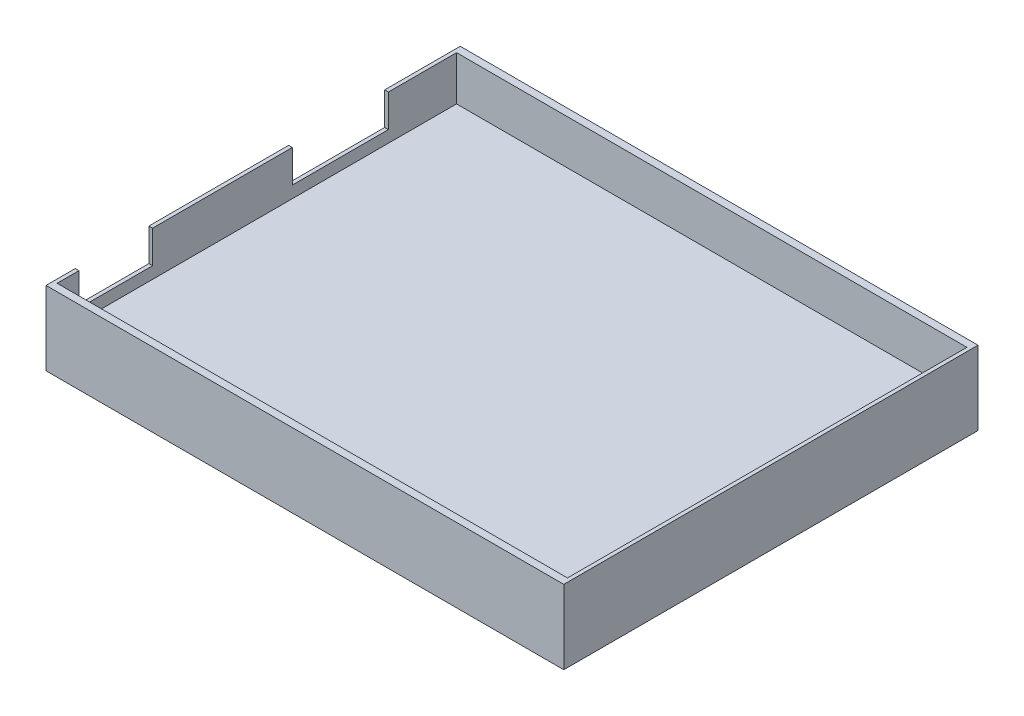
ISO-10303-21;
HEADER;
FILE_DESCRIPTION(('STEP AP214'),'2;1');
FILE_NAME('part.step','',(''),(''),'','','');
FILE_SCHEMA(('AUTOMOTIVE_DESIGN { 1 0 10303 214 1 1 1 1 }'));
ENDSEC;
DATA;
#1=APPLICATION_CONTEXT('core data for automotive mechanical design processes');
#2=APPLICATION_PROTOCOL_DEFINITION('international standard','automotive_design',2000,#1);
#3=PRODUCT_CONTEXT('',#1,'mechanical');
#4=PRODUCT('Part','Part','',(#3));
#5=PRODUCT_RELATED_PRODUCT_CATEGORY('part','',(#4));
#6=PRODUCT_DEFINITION_FORMATION('','',#4);
#7=PRODUCT_DEFINITION_CONTEXT('part definition',#1,'design');
#8=PRODUCT_DEFINITION('design','',#6,#7);
#9=PRODUCT_DEFINITION_SHAPE('','',#8);
#10=(LENGTH_UNIT() NAMED_UNIT(*) SI_UNIT(.MILLI.,.METRE.));
#11=(NAMED_UNIT(*) PLANE_ANGLE_UNIT() SI_UNIT($,.RADIAN.));
#12=(NAMED_UNIT(*) SI_UNIT($,.STERADIAN.) SOLID_ANGLE_UNIT());
#13=UNCERTAINTY_MEASURE_WITH_UNIT(LENGTH_MEASURE(1.E-05),#10,'distance_accuracy_value','');
#14=(GEOMETRIC_REPRESENTATION_CONTEXT(3) GLOBAL_UNCERTAINTY_ASSIGNED_CONTEXT((#13)) GLOBAL_UNIT_ASSIGNED_CONTEXT((#10,
#11,#12)) REPRESENTATION_CONTEXT('',''));
#15=CARTESIAN_POINT('',(0.,0.,0.));
#16=DIRECTION('',(0.,0.,1.));
#17=DIRECTION('',(1.,0.,0.));
#18=AXIS2_PLACEMENT_3D('',#15,#16,#17);
#19=CARTESIAN_POINT('',(0.,10.,0.));
#20=DIRECTION('',(0.,-1.,0.));
#21=DIRECTION('',(0.,0.,-1.));
#22=AXIS2_PLACEMENT_3D('',#19,#20,#21);
#23=PLANE('',#22);
#24=DIRECTION('',(0.,0.,1.));
#25=VECTOR('',#24,1.);
#26=CARTESIAN_POINT('',(-34.5,10.,27.));
#27=LINE('',#26,#25);
#28=CARTESIAN_POINT('',(-34.5,10.,-4.79624898113309));
#29=VERTEX_POINT('',#28);
#30=CARTESIAN_POINT('',(-34.5,10.,14.096419397395));
#31=VERTEX_POINT('',#30);
#32=EDGE_CURVE('E233',#29,#31,#27,.T.);
#33=ORIENTED_EDGE('',*,*,#32,.F.);
#34=DIRECTION('',(-1.,0.,0.));
#35=VECTOR('',#34,1.);
#36=CARTESIAN_POINT('',(0.,10.,-4.79624898113309));
#37=LINE('',#36,#35);
#38=CARTESIAN_POINT('',(-35.,10.,-4.79624898113309));
#39=VERTEX_POINT('',#38);
#40=EDGE_CURVE('E205',#29,#39,#37,.T.);
#41=ORIENTED_EDGE('',*,*,#40,.T.);
#42=DIRECTION('',(0.,0.,1.));
#43=VECTOR('',#42,1.);
#44=CARTESIAN_POINT('',(-35.,10.,28.));
#45=LINE('',#44,#43);
#46=CARTESIAN_POINT('',(-35.,10.,14.096419397395));
#47=VERTEX_POINT('',#46);
#48=EDGE_CURVE('E270',#39,#47,#45,.T.);
#49=ORIENTED_EDGE('',*,*,#48,.T.);
#50=DIRECTION('',(1.,0.,0.));
#51=VECTOR('',#50,1.);
#52=CARTESIAN_POINT('',(0.,10.,14.096419397395));
#53=LINE('',#52,#51);
#54=EDGE_CURVE('E179',#47,#31,#53,.T.);
#55=ORIENTED_EDGE('',*,*,#54,.T.);
#56=EDGE_LOOP('',(#33,#41,#49,#55));
#57=FACE_BOUND('',#56,.T.);
#58=ADVANCED_FACE('F38',(#57),#23,.F.);
#59=CARTESIAN_POINT('',(35.,10.,28.));
#60=DIRECTION('',(-1.,0.,0.));
#61=DIRECTION('',(0.,0.,1.));
#62=AXIS2_PLACEMENT_3D('',#59,#60,#61);
#63=PLANE('',#62);
#64=DIRECTION('',(0.,0.,-1.));
#65=VECTOR('',#64,1.);
#66=CARTESIAN_POINT('',(35.,0.,28.));
#67=LINE('',#66,#65);
#68=CARTESIAN_POINT('',(35.,0.,28.));
#69=VERTEX_POINT('',#68);
#70=CARTESIAN_POINT('',(35.,0.,-28.));
#71=VERTEX_POINT('',#70);
#72=EDGE_CURVE('E247',#69,#71,#67,.T.);
#73=ORIENTED_EDGE('',*,*,#72,.T.);
#74=DIRECTION('',(0.,-1.,0.));
#75=VECTOR('',#74,1.);
#76=CARTESIAN_POINT('',(35.,10.,-28.));
#77=LINE('',#76,#75);
#78=CARTESIAN_POINT('',(35.,10.,-28.));
#79=VERTEX_POINT('',#78);
#80=EDGE_CURVE('E296',#79,#71,#77,.T.);
#81=ORIENTED_EDGE('',*,*,#80,.F.);
#82=DIRECTION('',(0.,0.,-1.));
#83=VECTOR('',#82,1.);
#84=CARTESIAN_POINT('',(35.,10.,28.));
#85=LINE('',#84,#83);
#86=CARTESIAN_POINT('',(35.,10.,28.));
#87=VERTEX_POINT('',#86);
#88=EDGE_CURVE('E257',#87,#79,#85,.T.);
#89=ORIENTED_EDGE('',*,*,#88,.F.);
#90=DIRECTION('',(0.,-1.,0.));
#91=VECTOR('',#90,1.);
#92=CARTESIAN_POINT('',(35.,10.,28.));
#93=LINE('',#92,#91);
#94=EDGE_CURVE('E273',#87,#69,#93,.T.);
#95=ORIENTED_EDGE('',*,*,#94,.T.);
#96=EDGE_LOOP('',(#73,#81,#89,#95));
#97=FACE_BOUND('',#96,.T.);
#98=ADVANCED_FACE('F40',(#97),#63,.F.);
#99=CARTESIAN_POINT('',(-35.,10.,-28.));
#100=DIRECTION('',(0.,0.,1.));
#101=DIRECTION('',(1.,0.,0.));
#102=AXIS2_PLACEMENT_3D('',#99,#100,#101);
#103=PLANE('',#102);
#104=DIRECTION('',(-1.,0.,0.));
#105=VECTOR('',#104,1.);
#106=CARTESIAN_POINT('',(-35.,0.,-28.));
#107=LINE('',#106,#105);
#108=CARTESIAN_POINT('',(-35.,0.,-28.));
#109=VERTEX_POINT('',#108);
#110=EDGE_CURVE('E277',#71,#109,#107,.T.);
#111=ORIENTED_EDGE('',*,*,#110,.T.);
#112=DIRECTION('',(0.,-1.,0.));
#113=VECTOR('',#112,1.);
#114=CARTESIAN_POINT('',(-35.,10.,-28.));
#115=LINE('',#114,#113);
#116=CARTESIAN_POINT('',(-35.,10.,-28.));
#117=VERTEX_POINT('',#116);
#118=EDGE_CURVE('E292',#117,#109,#115,.T.);
#119=ORIENTED_EDGE('',*,*,#118,.F.);
#120=DIRECTION('',(-1.,0.,0.));
#121=VECTOR('',#120,1.);
#122=CARTESIAN_POINT('',(-35.,10.,-28.));
#123=LINE('',#122,#121);
#124=EDGE_CURVE('E261',#79,#117,#123,.T.);
#125=ORIENTED_EDGE('',*,*,#124,.F.);
#126=ORIENTED_EDGE('',*,*,#80,.T.);
#127=EDGE_LOOP('',(#111,#119,#125,#126));
#128=FACE_BOUND('',#127,.T.);
#129=ADVANCED_FACE('F381',(#128),#103,.F.);
#130=CARTESIAN_POINT('',(-35.,10.,28.));
#131=DIRECTION('',(1.,0.,0.));
#132=DIRECTION('',(0.,0.,-1.));
#133=AXIS2_PLACEMENT_3D('',#130,#131,#132);
#134=PLANE('',#133);
#135=ORIENTED_EDGE('',*,*,#48,.F.);
#136=DIRECTION('',(0.,1.,0.));
#137=VECTOR('',#136,1.);
#138=CARTESIAN_POINT('',(-35.,16.3548620356426,-4.79624898113309));
#139=LINE('',#138,#137);
#140=CARTESIAN_POINT('',(-35.,5.6,-4.79624898113309));
#141=VERTEX_POINT('',#140);
#142=EDGE_CURVE('E170',#141,#39,#139,.T.);
#143=ORIENTED_EDGE('',*,*,#142,.F.);
#144=DIRECTION('',(0.,0.,1.));
#145=VECTOR('',#144,1.);
#146=CARTESIAN_POINT('',(-35.,5.6,-4.79624898113309));
#147=LINE('',#146,#145);
#148=CARTESIAN_POINT('',(-35.,5.6,-17.7896473127418));
#149=VERTEX_POINT('',#148);
#150=EDGE_CURVE('E154',#149,#141,#147,.T.);
#151=ORIENTED_EDGE('',*,*,#150,.F.);
#152=DIRECTION('',(0.,-1.,0.));
#153=VECTOR('',#152,1.);
#154=CARTESIAN_POINT('',(-35.,16.3548620356426,-17.7896473127418));
#155=LINE('',#154,#153);
#156=CARTESIAN_POINT('',(-35.,10.,-17.7896473127418));
#157=VERTEX_POINT('',#156);
#158=EDGE_CURVE('E162',#157,#149,#155,.T.);
#159=ORIENTED_EDGE('',*,*,#158,.F.);
#160=EDGE_CURVE('E266',#117,#157,#45,.T.);
#161=ORIENTED_EDGE('',*,*,#160,.F.);
#162=ORIENTED_EDGE('',*,*,#118,.T.);
#163=DIRECTION('',(0.,0.,1.));
#164=VECTOR('',#163,1.);
#165=CARTESIAN_POINT('',(-35.,0.,28.));
#166=LINE('',#165,#164);
#167=CARTESIAN_POINT('',(-35.,0.,28.));
#168=VERTEX_POINT('',#167);
#169=EDGE_CURVE('E280',#109,#168,#166,.T.);
#170=ORIENTED_EDGE('',*,*,#169,.T.);
#171=DIRECTION('',(0.,-1.,0.));
#172=VECTOR('',#171,1.);
#173=CARTESIAN_POINT('',(-35.,10.,28.));
#174=LINE('',#173,#172);
#175=CARTESIAN_POINT('',(-35.,10.,28.));
#176=VERTEX_POINT('',#175);
#177=EDGE_CURVE('E288',#176,#168,#174,.T.);
#178=ORIENTED_EDGE('',*,*,#177,.F.);
#179=CARTESIAN_POINT('',(-35.,10.,24.0501544575814));
#180=VERTEX_POINT('',#179);
#181=EDGE_CURVE('E265',#180,#176,#45,.T.);
#182=ORIENTED_EDGE('',*,*,#181,.F.);
#183=DIRECTION('',(0.,1.,0.));
#184=VECTOR('',#183,1.);
#185=CARTESIAN_POINT('',(-35.,16.1,24.0501544575814));
#186=LINE('',#185,#184);
#187=CARTESIAN_POINT('',(-35.,5.6,24.0501544575814));
#188=VERTEX_POINT('',#187);
#189=EDGE_CURVE('E181',#188,#180,#186,.T.);
#190=ORIENTED_EDGE('',*,*,#189,.F.);
#191=DIRECTION('',(0.,0.,1.));
#192=VECTOR('',#191,1.);
#193=CARTESIAN_POINT('',(-35.,5.6,24.0501544575814));
#194=LINE('',#193,#192);
#195=CARTESIAN_POINT('',(-35.,5.6,14.096419397395));
#196=VERTEX_POINT('',#195);
#197=EDGE_CURVE('E187',#196,#188,#194,.T.);
#198=ORIENTED_EDGE('',*,*,#197,.F.);
#199=DIRECTION('',(0.,-1.,0.));
#200=VECTOR('',#199,1.);
#201=CARTESIAN_POINT('',(-35.,16.1,14.096419397395));
#202=LINE('',#201,#200);
#203=EDGE_CURVE('E184',#47,#196,#202,.T.);
#204=ORIENTED_EDGE('',*,*,#203,.F.);
#205=EDGE_LOOP('',(#135,#143,#151,#159,#161,#162,#170,#178,#182,#190,#198,#204));
#206=FACE_BOUND('',#205,.T.);
#207=ADVANCED_FACE('F173',(#206),#134,.F.);
#208=CARTESIAN_POINT('',(-35.,10.,28.));
#209=DIRECTION('',(0.,0.,-1.));
#210=DIRECTION('',(-1.,0.,0.));
#211=AXIS2_PLACEMENT_3D('',#208,#209,#210);
#212=PLANE('',#211);
#213=DIRECTION('',(1.,0.,0.));
#214=VECTOR('',#213,1.);
#215=CARTESIAN_POINT('',(-35.,0.,28.));
#216=LINE('',#215,#214);
#217=EDGE_CURVE('E262',#168,#69,#216,.T.);
#218=ORIENTED_EDGE('',*,*,#217,.T.);
#219=ORIENTED_EDGE('',*,*,#94,.F.);
#220=DIRECTION('',(1.,0.,0.));
#221=VECTOR('',#220,1.);
#222=CARTESIAN_POINT('',(-35.,10.,28.));
#223=LINE('',#222,#221);
#224=EDGE_CURVE('E269',#176,#87,#223,.T.);
#225=ORIENTED_EDGE('',*,*,#224,.F.);
#226=ORIENTED_EDGE('',*,*,#177,.T.);
#227=EDGE_LOOP('',(#218,#219,#225,#226));
#228=FACE_BOUND('',#227,.T.);
#229=ADVANCED_FACE('F333',(#228),#212,.F.);
#230=ORIENTED_EDGE('',*,*,#160,.T.);
#231=DIRECTION('',(1.,0.,0.));
#232=VECTOR('',#231,1.);
#233=CARTESIAN_POINT('',(0.,10.,-17.7896473127418));
#234=LINE('',#233,#232);
#235=CARTESIAN_POINT('',(-34.5,10.,-17.7896473127418));
#236=VERTEX_POINT('',#235);
#237=EDGE_CURVE('E165',#157,#236,#234,.T.);
#238=ORIENTED_EDGE('',*,*,#237,.T.);
#239=CARTESIAN_POINT('',(-34.5,10.,-27.));
#240=VERTEX_POINT('',#239);
#241=EDGE_CURVE('E228',#240,#236,#27,.T.);
#242=ORIENTED_EDGE('',*,*,#241,.F.);
#243=DIRECTION('',(-1.,0.,0.));
#244=VECTOR('',#243,1.);
#245=CARTESIAN_POINT('',(34.5,10.,-27.));
#246=LINE('',#245,#244);
#247=CARTESIAN_POINT('',(34.5,10.,-27.));
#248=VERTEX_POINT('',#247);
#249=EDGE_CURVE('E215',#248,#240,#246,.T.);
#250=ORIENTED_EDGE('',*,*,#249,.F.);
#251=DIRECTION('',(0.,0.,-1.));
#252=VECTOR('',#251,1.);
#253=CARTESIAN_POINT('',(34.5,10.,27.));
#254=LINE('',#253,#252);
#255=CARTESIAN_POINT('',(34.5,10.,27.));
#256=VERTEX_POINT('',#255);
#257=EDGE_CURVE('E237',#256,#248,#254,.T.);
#258=ORIENTED_EDGE('',*,*,#257,.F.);
#259=DIRECTION('',(1.,0.,0.));
#260=VECTOR('',#259,1.);
#261=CARTESIAN_POINT('',(34.5,10.,27.));
#262=LINE('',#261,#260);
#263=CARTESIAN_POINT('',(-34.5,10.,27.));
#264=VERTEX_POINT('',#263);
#265=EDGE_CURVE('E232',#264,#256,#262,.T.);
#266=ORIENTED_EDGE('',*,*,#265,.F.);
#267=CARTESIAN_POINT('',(-34.5,10.,24.0501544575814));
#268=VERTEX_POINT('',#267);
#269=EDGE_CURVE('E209',#268,#264,#27,.T.);
#270=ORIENTED_EDGE('',*,*,#269,.F.);
#271=DIRECTION('',(-1.,0.,0.));
#272=VECTOR('',#271,1.);
#273=CARTESIAN_POINT('',(0.,10.,24.0501544575814));
#274=LINE('',#273,#272);
#275=EDGE_CURVE('E199',#268,#180,#274,.T.);
#276=ORIENTED_EDGE('',*,*,#275,.T.);
#277=ORIENTED_EDGE('',*,*,#181,.T.);
#278=ORIENTED_EDGE('',*,*,#224,.T.);
#279=ORIENTED_EDGE('',*,*,#88,.T.);
#280=ORIENTED_EDGE('',*,*,#124,.T.);
#281=EDGE_LOOP('',(#230,#238,#242,#250,#258,#266,#270,#276,#277,#278,#279,#280));
#282=FACE_BOUND('',#281,.T.);
#283=ADVANCED_FACE('F321',(#282),#23,.F.);
#284=CARTESIAN_POINT('',(0.,0.,0.));
#285=DIRECTION('',(0.,-1.,0.));
#286=DIRECTION('',(0.,0.,-1.));
#287=AXIS2_PLACEMENT_3D('',#284,#285,#286);
#288=PLANE('',#287);
#289=ORIENTED_EDGE('',*,*,#72,.F.);
#290=ORIENTED_EDGE('',*,*,#217,.F.);
#291=ORIENTED_EDGE('',*,*,#169,.F.);
#292=ORIENTED_EDGE('',*,*,#110,.F.);
#293=EDGE_LOOP('',(#289,#290,#291,#292));
#294=FACE_BOUND('',#293,.T.);
#295=ADVANCED_FACE('F330',(#294),#288,.T.);
#296=CARTESIAN_POINT('',(-34.5,4.,27.));
#297=DIRECTION('',(-1.,0.,0.));
#298=DIRECTION('',(0.,0.,1.));
#299=AXIS2_PLACEMENT_3D('',#296,#297,#298);
#300=PLANE('',#299);
#301=DIRECTION('',(0.,0.,1.));
#302=VECTOR('',#301,1.);
#303=CARTESIAN_POINT('',(-34.5,5.6,27.));
#304=LINE('',#303,#302);
#305=CARTESIAN_POINT('',(-34.5,5.6,-17.7896473127418));
#306=VERTEX_POINT('',#305);
#307=CARTESIAN_POINT('',(-34.5,5.6,-4.79624898113309));
#308=VERTEX_POINT('',#307);
#309=EDGE_CURVE('E47',#306,#308,#304,.T.);
#310=ORIENTED_EDGE('',*,*,#309,.T.);
#311=DIRECTION('',(0.,1.,0.));
#312=VECTOR('',#311,1.);
#313=CARTESIAN_POINT('',(-34.5,4.,-4.79624898113309));
#314=LINE('',#313,#312);
#315=EDGE_CURVE('E11',#308,#29,#314,.T.);
#316=ORIENTED_EDGE('',*,*,#315,.T.);
#317=ORIENTED_EDGE('',*,*,#32,.T.);
#318=DIRECTION('',(0.,-1.,0.));
#319=VECTOR('',#318,1.);
#320=CARTESIAN_POINT('',(-34.5,4.,14.096419397395));
#321=LINE('',#320,#319);
#322=CARTESIAN_POINT('',(-34.5,5.6,14.096419397395));
#323=VERTEX_POINT('',#322);
#324=EDGE_CURVE('E300',#31,#323,#321,.T.);
#325=ORIENTED_EDGE('',*,*,#324,.T.);
#326=DIRECTION('',(0.,0.,1.));
#327=VECTOR('',#326,1.);
#328=CARTESIAN_POINT('',(-34.5,5.6,27.));
#329=LINE('',#328,#327);
#330=CARTESIAN_POINT('',(-34.5,5.6,24.0501544575814));
#331=VERTEX_POINT('',#330);
#332=EDGE_CURVE('E304',#323,#331,#329,.T.);
#333=ORIENTED_EDGE('',*,*,#332,.T.);
#334=DIRECTION('',(0.,1.,0.));
#335=VECTOR('',#334,1.);
#336=CARTESIAN_POINT('',(-34.5,4.,24.0501544575814));
#337=LINE('',#336,#335);
#338=EDGE_CURVE('E308',#331,#268,#337,.T.);
#339=ORIENTED_EDGE('',*,*,#338,.T.);
#340=ORIENTED_EDGE('',*,*,#269,.T.);
#341=DIRECTION('',(0.,1.,0.));
#342=VECTOR('',#341,1.);
#343=CARTESIAN_POINT('',(-34.5,4.,27.));
#344=LINE('',#343,#342);
#345=CARTESIAN_POINT('',(-34.5,4.,27.));
#346=VERTEX_POINT('',#345);
#347=EDGE_CURVE('E227',#346,#264,#344,.T.);
#348=ORIENTED_EDGE('',*,*,#347,.F.);
#349=DIRECTION('',(0.,0.,1.));
#350=VECTOR('',#349,1.);
#351=CARTESIAN_POINT('',(-34.5,4.,27.));
#352=LINE('',#351,#350);
#353=CARTESIAN_POINT('',(-34.5,4.,-27.));
#354=VERTEX_POINT('',#353);
#355=EDGE_CURVE('E210',#354,#346,#352,.T.);
#356=ORIENTED_EDGE('',*,*,#355,.F.);
#357=DIRECTION('',(0.,1.,0.));
#358=VECTOR('',#357,1.);
#359=CARTESIAN_POINT('',(-34.5,4.,-27.));
#360=LINE('',#359,#358);
#361=EDGE_CURVE('E244',#354,#240,#360,.T.);
#362=ORIENTED_EDGE('',*,*,#361,.T.);
#363=ORIENTED_EDGE('',*,*,#241,.T.);
#364=DIRECTION('',(0.,-1.,0.));
#365=VECTOR('',#364,1.);
#366=CARTESIAN_POINT('',(-34.5,4.,-17.7896473127418));
#367=LINE('',#366,#365);
#368=EDGE_CURVE('E312',#236,#306,#367,.T.);
#369=ORIENTED_EDGE('',*,*,#368,.T.);
#370=EDGE_LOOP('',(#310,#316,#317,#325,#333,#339,#340,#348,#356,#362,#363,#369));
#371=FACE_BOUND('',#370,.T.);
#372=ADVANCED_FACE('F316',(#371),#300,.F.);
#373=CARTESIAN_POINT('',(34.5,4.,-27.));
#374=DIRECTION('',(0.,0.,-1.));
#375=DIRECTION('',(-1.,0.,0.));
#376=AXIS2_PLACEMENT_3D('',#373,#374,#375);
#377=PLANE('',#376);
#378=ORIENTED_EDGE('',*,*,#249,.T.);
#379=ORIENTED_EDGE('',*,*,#361,.F.);
#380=DIRECTION('',(-1.,0.,0.));
#381=VECTOR('',#380,1.);
#382=CARTESIAN_POINT('',(34.5,4.,-27.));
#383=LINE('',#382,#381);
#384=CARTESIAN_POINT('',(34.5,4.,-27.));
#385=VERTEX_POINT('',#384);
#386=EDGE_CURVE('E223',#385,#354,#383,.T.);
#387=ORIENTED_EDGE('',*,*,#386,.F.);
#388=DIRECTION('',(0.,1.,0.));
#389=VECTOR('',#388,1.);
#390=CARTESIAN_POINT('',(34.5,4.,-27.));
#391=LINE('',#390,#389);
#392=EDGE_CURVE('E248',#385,#248,#391,.T.);
#393=ORIENTED_EDGE('',*,*,#392,.T.);
#394=EDGE_LOOP('',(#378,#379,#387,#393));
#395=FACE_BOUND('',#394,.T.);
#396=ADVANCED_FACE('F363',(#395),#377,.F.);
#397=CARTESIAN_POINT('',(34.5,4.,27.));
#398=DIRECTION('',(1.,0.,0.));
#399=DIRECTION('',(0.,0.,-1.));
#400=AXIS2_PLACEMENT_3D('',#397,#398,#399);
#401=PLANE('',#400);
#402=ORIENTED_EDGE('',*,*,#257,.T.);
#403=ORIENTED_EDGE('',*,*,#392,.F.);
#404=DIRECTION('',(0.,0.,-1.));
#405=VECTOR('',#404,1.);
#406=CARTESIAN_POINT('',(34.5,4.,27.));
#407=LINE('',#406,#405);
#408=CARTESIAN_POINT('',(34.5,4.,27.));
#409=VERTEX_POINT('',#408);
#410=EDGE_CURVE('E219',#409,#385,#407,.T.);
#411=ORIENTED_EDGE('',*,*,#410,.F.);
#412=DIRECTION('',(0.,1.,0.));
#413=VECTOR('',#412,1.);
#414=CARTESIAN_POINT('',(34.5,4.,27.));
#415=LINE('',#414,#413);
#416=EDGE_CURVE('E251',#409,#256,#415,.T.);
#417=ORIENTED_EDGE('',*,*,#416,.T.);
#418=EDGE_LOOP('',(#402,#403,#411,#417));
#419=FACE_BOUND('',#418,.T.);
#420=ADVANCED_FACE('F357',(#419),#401,.F.);
#421=CARTESIAN_POINT('',(34.5,4.,27.));
#422=DIRECTION('',(0.,0.,1.));
#423=DIRECTION('',(1.,0.,0.));
#424=AXIS2_PLACEMENT_3D('',#421,#422,#423);
#425=PLANE('',#424);
#426=ORIENTED_EDGE('',*,*,#265,.T.);
#427=ORIENTED_EDGE('',*,*,#416,.F.);
#428=DIRECTION('',(1.,0.,0.));
#429=VECTOR('',#428,1.);
#430=CARTESIAN_POINT('',(34.5,4.,27.));
#431=LINE('',#430,#429);
#432=EDGE_CURVE('E214',#346,#409,#431,.T.);
#433=ORIENTED_EDGE('',*,*,#432,.F.);
#434=ORIENTED_EDGE('',*,*,#347,.T.);
#435=EDGE_LOOP('',(#426,#427,#433,#434));
#436=FACE_BOUND('',#435,.T.);
#437=ADVANCED_FACE('F354',(#436),#425,.F.);
#438=CARTESIAN_POINT('',(0.,4.,0.));
#439=DIRECTION('',(0.,1.,0.));
#440=DIRECTION('',(0.,0.,1.));
#441=AXIS2_PLACEMENT_3D('',#438,#439,#440);
#442=PLANE('',#441);
#443=ORIENTED_EDGE('',*,*,#355,.T.);
#444=ORIENTED_EDGE('',*,*,#432,.T.);
#445=ORIENTED_EDGE('',*,*,#410,.T.);
#446=ORIENTED_EDGE('',*,*,#386,.T.);
#447=EDGE_LOOP('',(#443,#444,#445,#446));
#448=FACE_BOUND('',#447,.T.);
#449=ADVANCED_FACE('F361',(#448),#442,.T.);
#450=CARTESIAN_POINT('',(-25.,16.1,24.0501544575814));
#451=DIRECTION('',(0.,0.,1.));
#452=DIRECTION('',(1.,0.,0.));
#453=AXIS2_PLACEMENT_3D('',#450,#451,#452);
#454=PLANE('',#453);
#455=ORIENTED_EDGE('',*,*,#338,.F.);
#456=DIRECTION('',(-1.,0.,0.));
#457=VECTOR('',#456,1.);
#458=CARTESIAN_POINT('',(-25.,5.6,24.0501544575814));
#459=LINE('',#458,#457);
#460=EDGE_CURVE('E191',#331,#188,#459,.T.);
#461=ORIENTED_EDGE('',*,*,#460,.T.);
#462=ORIENTED_EDGE('',*,*,#189,.T.);
#463=ORIENTED_EDGE('',*,*,#275,.F.);
#464=EDGE_LOOP('',(#455,#461,#462,#463));
#465=FACE_BOUND('',#464,.T.);
#466=ADVANCED_FACE('F445',(#465),#454,.F.);
#467=CARTESIAN_POINT('',(-25.,5.6,24.0501544575814));
#468=DIRECTION('',(0.,-1.,0.));
#469=DIRECTION('',(0.,0.,-1.));
#470=AXIS2_PLACEMENT_3D('',#467,#468,#469);
#471=PLANE('',#470);
#472=DIRECTION('',(-1.,0.,0.));
#473=VECTOR('',#472,1.);
#474=CARTESIAN_POINT('',(-25.,5.6,14.096419397395));
#475=LINE('',#474,#473);
#476=EDGE_CURVE('E62',#323,#196,#475,.T.);
#477=ORIENTED_EDGE('',*,*,#476,.T.);
#478=ORIENTED_EDGE('',*,*,#197,.T.);
#479=ORIENTED_EDGE('',*,*,#460,.F.);
#480=ORIENTED_EDGE('',*,*,#332,.F.);
#481=EDGE_LOOP('',(#477,#478,#479,#480));
#482=FACE_BOUND('',#481,.T.);
#483=ADVANCED_FACE('F457',(#482),#471,.F.);
#484=CARTESIAN_POINT('',(-25.,16.1,14.096419397395));
#485=DIRECTION('',(0.,0.,-1.));
#486=DIRECTION('',(-1.,0.,0.));
#487=AXIS2_PLACEMENT_3D('',#484,#485,#486);
#488=PLANE('',#487);
#489=ORIENTED_EDGE('',*,*,#203,.T.);
#490=ORIENTED_EDGE('',*,*,#476,.F.);
#491=ORIENTED_EDGE('',*,*,#324,.F.);
#492=ORIENTED_EDGE('',*,*,#54,.F.);
#493=EDGE_LOOP('',(#489,#490,#491,#492));
#494=FACE_BOUND('',#493,.T.);
#495=ADVANCED_FACE('F347',(#494),#488,.F.);
#496=CARTESIAN_POINT('',(-25.,16.3548620356426,-4.79624898113309));
#497=DIRECTION('',(0.,0.,1.));
#498=DIRECTION('',(1.,0.,0.));
#499=AXIS2_PLACEMENT_3D('',#496,#497,#498);
#500=PLANE('',#499);
#501=ORIENTED_EDGE('',*,*,#315,.F.);
#502=DIRECTION('',(-1.,0.,0.));
#503=VECTOR('',#502,1.);
#504=CARTESIAN_POINT('',(-25.,5.6,-4.79624898113309));
#505=LINE('',#504,#503);
#506=EDGE_CURVE('E159',#308,#141,#505,.T.);
#507=ORIENTED_EDGE('',*,*,#506,.T.);
#508=ORIENTED_EDGE('',*,*,#142,.T.);
#509=ORIENTED_EDGE('',*,*,#40,.F.);
#510=EDGE_LOOP('',(#501,#507,#508,#509));
#511=FACE_BOUND('',#510,.T.);
#512=ADVANCED_FACE('F474',(#511),#500,.F.);
#513=CARTESIAN_POINT('',(-25.,5.6,-4.79624898113309));
#514=DIRECTION('',(0.,-1.,0.));
#515=DIRECTION('',(0.,0.,-1.));
#516=AXIS2_PLACEMENT_3D('',#513,#514,#515);
#517=PLANE('',#516);
#518=DIRECTION('',(-1.,0.,0.));
#519=VECTOR('',#518,1.);
#520=CARTESIAN_POINT('',(-25.,5.6,-17.7896473127418));
#521=LINE('',#520,#519);
#522=EDGE_CURVE('E54',#306,#149,#521,.T.);
#523=ORIENTED_EDGE('',*,*,#522,.T.);
#524=ORIENTED_EDGE('',*,*,#150,.T.);
#525=ORIENTED_EDGE('',*,*,#506,.F.);
#526=ORIENTED_EDGE('',*,*,#309,.F.);
#527=EDGE_LOOP('',(#523,#524,#525,#526));
#528=FACE_BOUND('',#527,.T.);
#529=ADVANCED_FACE('F151',(#528),#517,.F.);
#530=CARTESIAN_POINT('',(-25.,16.3548620356426,-17.7896473127418));
#531=DIRECTION('',(0.,0.,-1.));
#532=DIRECTION('',(-1.,0.,0.));
#533=AXIS2_PLACEMENT_3D('',#530,#531,#532);
#534=PLANE('',#533);
#535=ORIENTED_EDGE('',*,*,#158,.T.);
#536=ORIENTED_EDGE('',*,*,#522,.F.);
#537=ORIENTED_EDGE('',*,*,#368,.F.);
#538=ORIENTED_EDGE('',*,*,#237,.F.);
#539=EDGE_LOOP('',(#535,#536,#537,#538));
#540=FACE_BOUND('',#539,.T.);
#541=ADVANCED_FACE('F163',(#540),#534,.F.);
#542=CLOSED_SHELL('',(#58,#98,#129,#207,#229,#283,#295,#372,#396,#420,#437,#449,#466,#483,#495,
#512,#529,#541));
#543=MANIFOLD_SOLID_BREP('B2',#542);
#544=ADVANCED_BREP_SHAPE_REPRESENTATION('',(#18,#543),#14);
#545=SHAPE_DEFINITION_REPRESENTATION(#9,#544);
ENDSEC;
END-ISO-10303-21;
